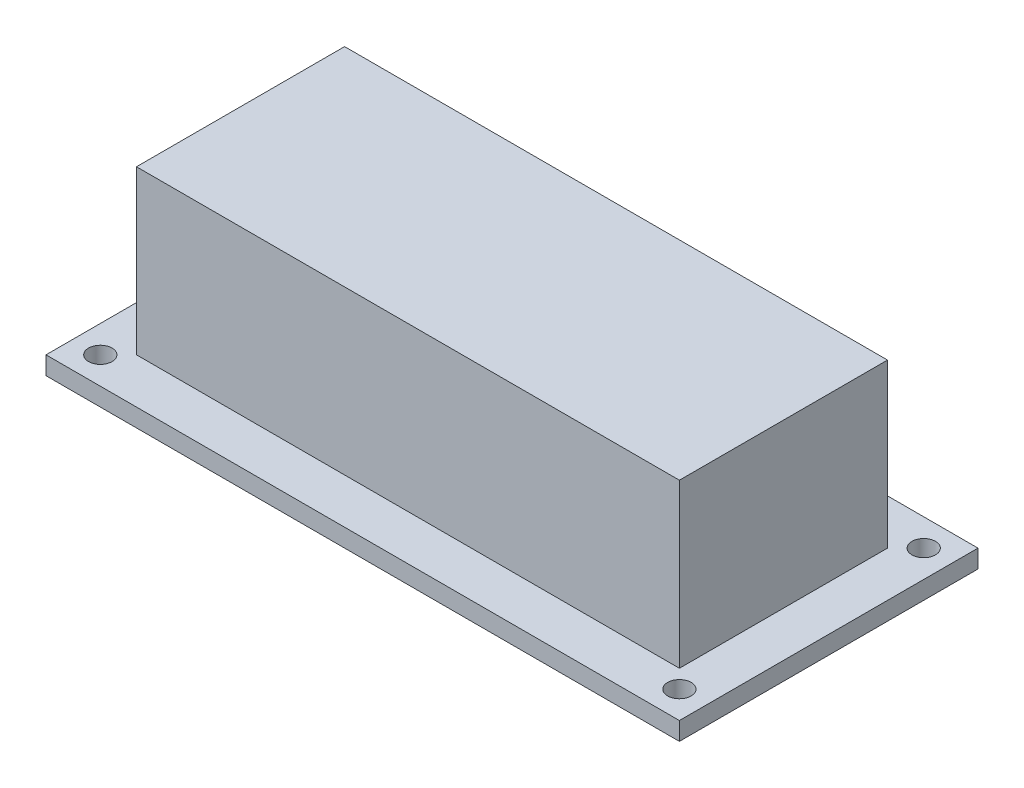
ISO-10303-21;
HEADER;
FILE_DESCRIPTION(('STEP AP214'),'2;1');
FILE_NAME('part.step','',(''),(''),'','','');
FILE_SCHEMA(('AUTOMOTIVE_DESIGN { 1 0 10303 214 1 1 1 1 }'));
ENDSEC;
DATA;
#1=APPLICATION_CONTEXT('core data for automotive mechanical design processes');
#2=APPLICATION_PROTOCOL_DEFINITION('international standard','automotive_design',2000,#1);
#3=PRODUCT_CONTEXT('',#1,'mechanical');
#4=PRODUCT('Part','Part','',(#3));
#5=PRODUCT_RELATED_PRODUCT_CATEGORY('part','',(#4));
#6=PRODUCT_DEFINITION_FORMATION('','',#4);
#7=PRODUCT_DEFINITION_CONTEXT('part definition',#1,'design');
#8=PRODUCT_DEFINITION('design','',#6,#7);
#9=PRODUCT_DEFINITION_SHAPE('','',#8);
#10=(LENGTH_UNIT() NAMED_UNIT(*) SI_UNIT(.MILLI.,.METRE.));
#11=(NAMED_UNIT(*) PLANE_ANGLE_UNIT() SI_UNIT($,.RADIAN.));
#12=(NAMED_UNIT(*) SI_UNIT($,.STERADIAN.) SOLID_ANGLE_UNIT());
#13=UNCERTAINTY_MEASURE_WITH_UNIT(LENGTH_MEASURE(1.E-05),#10,'distance_accuracy_value','');
#14=(GEOMETRIC_REPRESENTATION_CONTEXT(3) GLOBAL_UNCERTAINTY_ASSIGNED_CONTEXT((#13)) GLOBAL_UNIT_ASSIGNED_CONTEXT((#10,
#11,#12)) REPRESENTATION_CONTEXT('',''));
#15=CARTESIAN_POINT('',(0.,0.,0.));
#16=DIRECTION('',(0.,0.,1.));
#17=DIRECTION('',(1.,0.,0.));
#18=AXIS2_PLACEMENT_3D('',#15,#16,#17);
#19=CARTESIAN_POINT('',(0.,2.54,0.));
#20=DIRECTION('',(0.,1.,0.));
#21=DIRECTION('',(0.,0.,1.));
#22=AXIS2_PLACEMENT_3D('',#19,#20,#21);
#23=PLANE('',#22);
#24=CARTESIAN_POINT('',(-40.64,2.54,17.145));
#25=DIRECTION('',(0.,1.,0.));
#26=DIRECTION('',(0.,0.,1.));
#27=AXIS2_PLACEMENT_3D('',#24,#25,#26);
#28=CIRCLE('',#27,1.651);
#29=CARTESIAN_POINT('',(-40.64,2.54,18.796));
#30=VERTEX_POINT('',#29);
#31=EDGE_CURVE('E147',#30,#30,#28,.T.);
#32=ORIENTED_EDGE('',*,*,#31,.F.);
#33=EDGE_LOOP('',(#32));
#34=FACE_BOUND('',#33,.T.);
#35=CARTESIAN_POINT('',(40.64,2.54,17.145));
#36=DIRECTION('',(0.,1.,0.));
#37=DIRECTION('',(0.,0.,1.));
#38=AXIS2_PLACEMENT_3D('',#35,#36,#37);
#39=CIRCLE('',#38,1.651);
#40=CARTESIAN_POINT('',(40.64,2.54,18.796));
#41=VERTEX_POINT('',#40);
#42=EDGE_CURVE('E161',#41,#41,#39,.T.);
#43=ORIENTED_EDGE('',*,*,#42,.F.);
#44=EDGE_LOOP('',(#43));
#45=FACE_BOUND('',#44,.T.);
#46=CARTESIAN_POINT('',(40.64,2.54,-17.145));
#47=DIRECTION('',(0.,1.,0.));
#48=DIRECTION('',(0.,0.,1.));
#49=AXIS2_PLACEMENT_3D('',#46,#47,#48);
#50=CIRCLE('',#49,1.651);
#51=CARTESIAN_POINT('',(40.64,2.54,-15.494));
#52=VERTEX_POINT('',#51);
#53=EDGE_CURVE('E152',#52,#52,#50,.T.);
#54=ORIENTED_EDGE('',*,*,#53,.F.);
#55=EDGE_LOOP('',(#54));
#56=FACE_BOUND('',#55,.T.);
#57=CARTESIAN_POINT('',(-40.64,2.54,-17.145));
#58=DIRECTION('',(0.,1.,0.));
#59=DIRECTION('',(0.,0.,1.));
#60=AXIS2_PLACEMENT_3D('',#57,#58,#59);
#61=CIRCLE('',#60,1.651);
#62=CARTESIAN_POINT('',(-40.64,2.54,-15.494));
#63=VERTEX_POINT('',#62);
#64=EDGE_CURVE('E172',#63,#63,#61,.T.);
#65=ORIENTED_EDGE('',*,*,#64,.F.);
#66=EDGE_LOOP('',(#65));
#67=FACE_BOUND('',#66,.T.);
#68=DIRECTION('',(0.,0.,-1.));
#69=VECTOR('',#68,1.);
#70=CARTESIAN_POINT('',(44.45,2.54,-20.955));
#71=LINE('',#70,#69);
#72=CARTESIAN_POINT('',(44.45,2.54,20.955));
#73=VERTEX_POINT('',#72);
#74=CARTESIAN_POINT('',(44.45,2.54,-20.955));
#75=VERTEX_POINT('',#74);
#76=EDGE_CURVE('E180',#73,#75,#71,.T.);
#77=ORIENTED_EDGE('',*,*,#76,.T.);
#78=DIRECTION('',(-1.,0.,0.));
#79=VECTOR('',#78,1.);
#80=CARTESIAN_POINT('',(-44.45,2.54,-20.955));
#81=LINE('',#80,#79);
#82=CARTESIAN_POINT('',(-44.45,2.54,-20.955));
#83=VERTEX_POINT('',#82);
#84=EDGE_CURVE('E92',#75,#83,#81,.T.);
#85=ORIENTED_EDGE('',*,*,#84,.T.);
#86=DIRECTION('',(0.,0.,1.));
#87=VECTOR('',#86,1.);
#88=CARTESIAN_POINT('',(-44.45,2.54,-20.955));
#89=LINE('',#88,#87);
#90=CARTESIAN_POINT('',(-44.45,2.54,20.955));
#91=VERTEX_POINT('',#90);
#92=EDGE_CURVE('E185',#83,#91,#89,.T.);
#93=ORIENTED_EDGE('',*,*,#92,.T.);
#94=DIRECTION('',(1.,0.,0.));
#95=VECTOR('',#94,1.);
#96=CARTESIAN_POINT('',(-44.45,2.54,20.955));
#97=LINE('',#96,#95);
#98=EDGE_CURVE('E64',#91,#73,#97,.T.);
#99=ORIENTED_EDGE('',*,*,#98,.T.);
#100=EDGE_LOOP('',(#77,#85,#93,#99));
#101=FACE_BOUND('',#100,.T.);
#102=DIRECTION('',(0.,0.,-1.));
#103=VECTOR('',#102,1.);
#104=CARTESIAN_POINT('',(38.1,2.54,14.605));
#105=LINE('',#104,#103);
#106=CARTESIAN_POINT('',(38.1,2.54,14.605));
#107=VERTEX_POINT('',#106);
#108=CARTESIAN_POINT('',(38.1,2.54,-14.605));
#109=VERTEX_POINT('',#108);
#110=EDGE_CURVE('E363',#107,#109,#105,.T.);
#111=ORIENTED_EDGE('',*,*,#110,.F.);
#112=DIRECTION('',(1.,0.,0.));
#113=VECTOR('',#112,1.);
#114=CARTESIAN_POINT('',(-38.1,2.54,14.605));
#115=LINE('',#114,#113);
#116=CARTESIAN_POINT('',(-38.1,2.54,14.605));
#117=VERTEX_POINT('',#116);
#118=EDGE_CURVE('E139',#117,#107,#115,.T.);
#119=ORIENTED_EDGE('',*,*,#118,.F.);
#120=DIRECTION('',(0.,0.,1.));
#121=VECTOR('',#120,1.);
#122=CARTESIAN_POINT('',(-38.1,2.54,-14.605));
#123=LINE('',#122,#121);
#124=CARTESIAN_POINT('',(-38.1,2.54,-14.605));
#125=VERTEX_POINT('',#124);
#126=EDGE_CURVE('E135',#125,#117,#123,.T.);
#127=ORIENTED_EDGE('',*,*,#126,.F.);
#128=DIRECTION('',(-1.,0.,0.));
#129=VECTOR('',#128,1.);
#130=CARTESIAN_POINT('',(38.1,2.54,-14.605));
#131=LINE('',#130,#129);
#132=EDGE_CURVE('E359',#109,#125,#131,.T.);
#133=ORIENTED_EDGE('',*,*,#132,.F.);
#134=EDGE_LOOP('',(#111,#119,#127,#133));
#135=FACE_BOUND('',#134,.T.);
#136=ADVANCED_FACE('F39',(#34,#45,#56,#67,#101,#135),#23,.T.);
#137=CARTESIAN_POINT('',(44.45,2.54,-20.955));
#138=DIRECTION('',(-1.,0.,0.));
#139=DIRECTION('',(0.,0.,1.));
#140=AXIS2_PLACEMENT_3D('',#137,#138,#139);
#141=PLANE('',#140);
#142=DIRECTION('',(0.,0.,-1.));
#143=VECTOR('',#142,1.);
#144=CARTESIAN_POINT('',(44.45,0.,-20.955));
#145=LINE('',#144,#143);
#146=CARTESIAN_POINT('',(44.45,0.,20.955));
#147=VERTEX_POINT('',#146);
#148=CARTESIAN_POINT('',(44.45,0.,-20.955));
#149=VERTEX_POINT('',#148);
#150=EDGE_CURVE('E176',#147,#149,#145,.T.);
#151=ORIENTED_EDGE('',*,*,#150,.T.);
#152=DIRECTION('',(0.,-1.,0.));
#153=VECTOR('',#152,1.);
#154=CARTESIAN_POINT('',(44.45,2.54,-20.955));
#155=LINE('',#154,#153);
#156=EDGE_CURVE('E11',#75,#149,#155,.T.);
#157=ORIENTED_EDGE('',*,*,#156,.F.);
#158=ORIENTED_EDGE('',*,*,#76,.F.);
#159=DIRECTION('',(0.,-1.,0.));
#160=VECTOR('',#159,1.);
#161=CARTESIAN_POINT('',(44.45,2.54,20.955));
#162=LINE('',#161,#160);
#163=EDGE_CURVE('E190',#73,#147,#162,.T.);
#164=ORIENTED_EDGE('',*,*,#163,.T.);
#165=EDGE_LOOP('',(#151,#157,#158,#164));
#166=FACE_BOUND('',#165,.T.);
#167=ADVANCED_FACE('F41',(#166),#141,.F.);
#168=CARTESIAN_POINT('',(-44.45,2.54,-20.955));
#169=DIRECTION('',(0.,0.,1.));
#170=DIRECTION('',(1.,0.,0.));
#171=AXIS2_PLACEMENT_3D('',#168,#169,#170);
#172=PLANE('',#171);
#173=DIRECTION('',(-1.,0.,0.));
#174=VECTOR('',#173,1.);
#175=CARTESIAN_POINT('',(-44.45,0.,-20.955));
#176=LINE('',#175,#174);
#177=CARTESIAN_POINT('',(-44.45,0.,-20.955));
#178=VERTEX_POINT('',#177);
#179=EDGE_CURVE('E194',#149,#178,#176,.T.);
#180=ORIENTED_EDGE('',*,*,#179,.T.);
#181=DIRECTION('',(0.,-1.,0.));
#182=VECTOR('',#181,1.);
#183=CARTESIAN_POINT('',(-44.45,2.54,-20.955));
#184=LINE('',#183,#182);
#185=EDGE_CURVE('E48',#83,#178,#184,.T.);
#186=ORIENTED_EDGE('',*,*,#185,.F.);
#187=ORIENTED_EDGE('',*,*,#84,.F.);
#188=ORIENTED_EDGE('',*,*,#156,.T.);
#189=EDGE_LOOP('',(#180,#186,#187,#188));
#190=FACE_BOUND('',#189,.T.);
#191=ADVANCED_FACE('F229',(#190),#172,.F.);
#192=CARTESIAN_POINT('',(-44.45,2.54,-20.955));
#193=DIRECTION('',(1.,0.,0.));
#194=DIRECTION('',(0.,0.,-1.));
#195=AXIS2_PLACEMENT_3D('',#192,#193,#194);
#196=PLANE('',#195);
#197=DIRECTION('',(0.,0.,1.));
#198=VECTOR('',#197,1.);
#199=CARTESIAN_POINT('',(-44.45,0.,-20.955));
#200=LINE('',#199,#198);
#201=CARTESIAN_POINT('',(-44.45,0.,20.955));
#202=VERTEX_POINT('',#201);
#203=EDGE_CURVE('E197',#178,#202,#200,.T.);
#204=ORIENTED_EDGE('',*,*,#203,.T.);
#205=DIRECTION('',(0.,-1.,0.));
#206=VECTOR('',#205,1.);
#207=CARTESIAN_POINT('',(-44.45,2.54,20.955));
#208=LINE('',#207,#206);
#209=EDGE_CURVE('E204',#91,#202,#208,.T.);
#210=ORIENTED_EDGE('',*,*,#209,.F.);
#211=ORIENTED_EDGE('',*,*,#92,.F.);
#212=ORIENTED_EDGE('',*,*,#185,.T.);
#213=EDGE_LOOP('',(#204,#210,#211,#212));
#214=FACE_BOUND('',#213,.T.);
#215=ADVANCED_FACE('F211',(#214),#196,.F.);
#216=CARTESIAN_POINT('',(-44.45,2.54,20.955));
#217=DIRECTION('',(0.,0.,-1.));
#218=DIRECTION('',(-1.,0.,0.));
#219=AXIS2_PLACEMENT_3D('',#216,#217,#218);
#220=PLANE('',#219);
#221=DIRECTION('',(1.,0.,0.));
#222=VECTOR('',#221,1.);
#223=CARTESIAN_POINT('',(-44.45,0.,20.955));
#224=LINE('',#223,#222);
#225=EDGE_CURVE('E85',#202,#147,#224,.T.);
#226=ORIENTED_EDGE('',*,*,#225,.T.);
#227=ORIENTED_EDGE('',*,*,#163,.F.);
#228=ORIENTED_EDGE('',*,*,#98,.F.);
#229=ORIENTED_EDGE('',*,*,#209,.T.);
#230=EDGE_LOOP('',(#226,#227,#228,#229));
#231=FACE_BOUND('',#230,.T.);
#232=ADVANCED_FACE('F219',(#231),#220,.F.);
#233=CARTESIAN_POINT('',(0.,0.,0.));
#234=DIRECTION('',(0.,1.,0.));
#235=DIRECTION('',(0.,0.,1.));
#236=AXIS2_PLACEMENT_3D('',#233,#234,#235);
#237=PLANE('',#236);
#238=CARTESIAN_POINT('',(-40.64,0.,17.145));
#239=DIRECTION('',(0.,1.,0.));
#240=DIRECTION('',(0.,0.,1.));
#241=AXIS2_PLACEMENT_3D('',#238,#239,#240);
#242=CIRCLE('',#241,1.651);
#243=CARTESIAN_POINT('',(-40.64,0.,18.796));
#244=VERTEX_POINT('',#243);
#245=EDGE_CURVE('E142',#244,#244,#242,.T.);
#246=ORIENTED_EDGE('',*,*,#245,.T.);
#247=EDGE_LOOP('',(#246));
#248=FACE_BOUND('',#247,.T.);
#249=CARTESIAN_POINT('',(40.64,0.,17.145));
#250=DIRECTION('',(0.,1.,0.));
#251=DIRECTION('',(0.,0.,1.));
#252=AXIS2_PLACEMENT_3D('',#249,#250,#251);
#253=CIRCLE('',#252,1.651);
#254=CARTESIAN_POINT('',(40.64,0.,18.796));
#255=VERTEX_POINT('',#254);
#256=EDGE_CURVE('E165',#255,#255,#253,.T.);
#257=ORIENTED_EDGE('',*,*,#256,.T.);
#258=EDGE_LOOP('',(#257));
#259=FACE_BOUND('',#258,.T.);
#260=CARTESIAN_POINT('',(40.64,0.,-17.145));
#261=DIRECTION('',(0.,1.,0.));
#262=DIRECTION('',(0.,0.,1.));
#263=AXIS2_PLACEMENT_3D('',#260,#261,#262);
#264=CIRCLE('',#263,1.651);
#265=CARTESIAN_POINT('',(40.64,0.,-15.494));
#266=VERTEX_POINT('',#265);
#267=EDGE_CURVE('E157',#266,#266,#264,.T.);
#268=ORIENTED_EDGE('',*,*,#267,.T.);
#269=EDGE_LOOP('',(#268));
#270=FACE_BOUND('',#269,.T.);
#271=CARTESIAN_POINT('',(-40.64,0.,-17.145));
#272=DIRECTION('',(0.,1.,0.));
#273=DIRECTION('',(0.,0.,1.));
#274=AXIS2_PLACEMENT_3D('',#271,#272,#273);
#275=CIRCLE('',#274,1.651);
#276=CARTESIAN_POINT('',(-40.64,0.,-15.494));
#277=VERTEX_POINT('',#276);
#278=EDGE_CURVE('E156',#277,#277,#275,.T.);
#279=ORIENTED_EDGE('',*,*,#278,.T.);
#280=EDGE_LOOP('',(#279));
#281=FACE_BOUND('',#280,.T.);
#282=ORIENTED_EDGE('',*,*,#150,.F.);
#283=ORIENTED_EDGE('',*,*,#225,.F.);
#284=ORIENTED_EDGE('',*,*,#203,.F.);
#285=ORIENTED_EDGE('',*,*,#179,.F.);
#286=EDGE_LOOP('',(#282,#283,#284,#285));
#287=FACE_BOUND('',#286,.T.);
#288=ADVANCED_FACE('F215',(#248,#259,#270,#281,#287),#237,.F.);
#289=CARTESIAN_POINT('',(-40.64,2.54,-17.145));
#290=DIRECTION('',(0.,-1.,0.));
#291=DIRECTION('',(0.,0.,-1.));
#292=AXIS2_PLACEMENT_3D('',#289,#290,#291);
#293=CYLINDRICAL_SURFACE('',#292,1.651);
#294=ORIENTED_EDGE('',*,*,#64,.T.);
#295=EDGE_LOOP('',(#294));
#296=FACE_BOUND('',#295,.T.);
#297=ORIENTED_EDGE('',*,*,#278,.F.);
#298=EDGE_LOOP('',(#297));
#299=FACE_BOUND('',#298,.T.);
#300=ADVANCED_FACE('F226',(#296,#299),#293,.F.);
#301=CARTESIAN_POINT('',(40.64,2.54,-17.145));
#302=DIRECTION('',(0.,-1.,0.));
#303=DIRECTION('',(0.,0.,-1.));
#304=AXIS2_PLACEMENT_3D('',#301,#302,#303);
#305=CYLINDRICAL_SURFACE('',#304,1.651);
#306=ORIENTED_EDGE('',*,*,#53,.T.);
#307=EDGE_LOOP('',(#306));
#308=FACE_BOUND('',#307,.T.);
#309=ORIENTED_EDGE('',*,*,#267,.F.);
#310=EDGE_LOOP('',(#309));
#311=FACE_BOUND('',#310,.T.);
#312=ADVANCED_FACE('F242',(#308,#311),#305,.F.);
#313=CARTESIAN_POINT('',(40.64,2.54,17.145));
#314=DIRECTION('',(0.,-1.,0.));
#315=DIRECTION('',(0.,0.,-1.));
#316=AXIS2_PLACEMENT_3D('',#313,#314,#315);
#317=CYLINDRICAL_SURFACE('',#316,1.651);
#318=ORIENTED_EDGE('',*,*,#42,.T.);
#319=EDGE_LOOP('',(#318));
#320=FACE_BOUND('',#319,.T.);
#321=ORIENTED_EDGE('',*,*,#256,.F.);
#322=EDGE_LOOP('',(#321));
#323=FACE_BOUND('',#322,.T.);
#324=ADVANCED_FACE('F247',(#320,#323),#317,.F.);
#325=CARTESIAN_POINT('',(-40.64,2.54,17.145));
#326=DIRECTION('',(0.,-1.,0.));
#327=DIRECTION('',(0.,0.,-1.));
#328=AXIS2_PLACEMENT_3D('',#325,#326,#327);
#329=CYLINDRICAL_SURFACE('',#328,1.651);
#330=ORIENTED_EDGE('',*,*,#31,.T.);
#331=EDGE_LOOP('',(#330));
#332=FACE_BOUND('',#331,.T.);
#333=ORIENTED_EDGE('',*,*,#245,.F.);
#334=EDGE_LOOP('',(#333));
#335=FACE_BOUND('',#334,.T.);
#336=ADVANCED_FACE('F244',(#332,#335),#329,.F.);
#337=CARTESIAN_POINT('',(-38.1,25.4,14.605));
#338=DIRECTION('',(0.,0.,-1.));
#339=DIRECTION('',(-1.,0.,0.));
#340=AXIS2_PLACEMENT_3D('',#337,#338,#339);
#341=PLANE('',#340);
#342=ORIENTED_EDGE('',*,*,#118,.T.);
#343=DIRECTION('',(0.,-1.,0.));
#344=VECTOR('',#343,1.);
#345=CARTESIAN_POINT('',(38.1,25.4,14.605));
#346=LINE('',#345,#344);
#347=CARTESIAN_POINT('',(38.1,25.4,14.605));
#348=VERTEX_POINT('',#347);
#349=EDGE_CURVE('E118',#348,#107,#346,.T.);
#350=ORIENTED_EDGE('',*,*,#349,.F.);
#351=DIRECTION('',(1.,0.,0.));
#352=VECTOR('',#351,1.);
#353=CARTESIAN_POINT('',(-38.1,25.4,14.605));
#354=LINE('',#353,#352);
#355=CARTESIAN_POINT('',(-38.1,25.4,14.605));
#356=VERTEX_POINT('',#355);
#357=EDGE_CURVE('E126',#356,#348,#354,.T.);
#358=ORIENTED_EDGE('',*,*,#357,.F.);
#359=DIRECTION('',(0.,-1.,0.));
#360=VECTOR('',#359,1.);
#361=CARTESIAN_POINT('',(-38.1,25.4,14.605));
#362=LINE('',#361,#360);
#363=EDGE_CURVE('E355',#356,#117,#362,.T.);
#364=ORIENTED_EDGE('',*,*,#363,.T.);
#365=EDGE_LOOP('',(#342,#350,#358,#364));
#366=FACE_BOUND('',#365,.T.);
#367=ADVANCED_FACE('F137',(#366),#341,.F.);
#368=CARTESIAN_POINT('',(38.1,25.4,14.605));
#369=DIRECTION('',(-1.,0.,0.));
#370=DIRECTION('',(0.,0.,1.));
#371=AXIS2_PLACEMENT_3D('',#368,#369,#370);
#372=PLANE('',#371);
#373=ORIENTED_EDGE('',*,*,#110,.T.);
#374=DIRECTION('',(0.,-1.,0.));
#375=VECTOR('',#374,1.);
#376=CARTESIAN_POINT('',(38.1,25.4,-14.605));
#377=LINE('',#376,#375);
#378=CARTESIAN_POINT('',(38.1,25.4,-14.605));
#379=VERTEX_POINT('',#378);
#380=EDGE_CURVE('E121',#379,#109,#377,.T.);
#381=ORIENTED_EDGE('',*,*,#380,.F.);
#382=DIRECTION('',(0.,0.,-1.));
#383=VECTOR('',#382,1.);
#384=CARTESIAN_POINT('',(38.1,25.4,14.605));
#385=LINE('',#384,#383);
#386=EDGE_CURVE('E114',#348,#379,#385,.T.);
#387=ORIENTED_EDGE('',*,*,#386,.F.);
#388=ORIENTED_EDGE('',*,*,#349,.T.);
#389=EDGE_LOOP('',(#373,#381,#387,#388));
#390=FACE_BOUND('',#389,.T.);
#391=ADVANCED_FACE('F116',(#390),#372,.F.);
#392=CARTESIAN_POINT('',(38.1,25.4,-14.605));
#393=DIRECTION('',(0.,0.,1.));
#394=DIRECTION('',(1.,0.,0.));
#395=AXIS2_PLACEMENT_3D('',#392,#393,#394);
#396=PLANE('',#395);
#397=ORIENTED_EDGE('',*,*,#132,.T.);
#398=DIRECTION('',(0.,-1.,0.));
#399=VECTOR('',#398,1.);
#400=CARTESIAN_POINT('',(-38.1,25.4,-14.605));
#401=LINE('',#400,#399);
#402=CARTESIAN_POINT('',(-38.1,25.4,-14.605));
#403=VERTEX_POINT('',#402);
#404=EDGE_CURVE('E55',#403,#125,#401,.T.);
#405=ORIENTED_EDGE('',*,*,#404,.F.);
#406=DIRECTION('',(-1.,0.,0.));
#407=VECTOR('',#406,1.);
#408=CARTESIAN_POINT('',(38.1,25.4,-14.605));
#409=LINE('',#408,#407);
#410=EDGE_CURVE('E125',#379,#403,#409,.T.);
#411=ORIENTED_EDGE('',*,*,#410,.F.);
#412=ORIENTED_EDGE('',*,*,#380,.T.);
#413=EDGE_LOOP('',(#397,#405,#411,#412));
#414=FACE_BOUND('',#413,.T.);
#415=ADVANCED_FACE('F259',(#414),#396,.F.);
#416=CARTESIAN_POINT('',(-38.1,25.4,-14.605));
#417=DIRECTION('',(1.,0.,0.));
#418=DIRECTION('',(0.,0.,-1.));
#419=AXIS2_PLACEMENT_3D('',#416,#417,#418);
#420=PLANE('',#419);
#421=ORIENTED_EDGE('',*,*,#126,.T.);
#422=ORIENTED_EDGE('',*,*,#363,.F.);
#423=DIRECTION('',(0.,0.,1.));
#424=VECTOR('',#423,1.);
#425=CARTESIAN_POINT('',(-38.1,25.4,-14.605));
#426=LINE('',#425,#424);
#427=EDGE_CURVE('E130',#403,#356,#426,.T.);
#428=ORIENTED_EDGE('',*,*,#427,.F.);
#429=ORIENTED_EDGE('',*,*,#404,.T.);
#430=EDGE_LOOP('',(#421,#422,#428,#429));
#431=FACE_BOUND('',#430,.T.);
#432=ADVANCED_FACE('F262',(#431),#420,.F.);
#433=CARTESIAN_POINT('',(0.,25.4,0.));
#434=DIRECTION('',(0.,1.,0.));
#435=DIRECTION('',(0.,0.,1.));
#436=AXIS2_PLACEMENT_3D('',#433,#434,#435);
#437=PLANE('',#436);
#438=ORIENTED_EDGE('',*,*,#357,.T.);
#439=ORIENTED_EDGE('',*,*,#386,.T.);
#440=ORIENTED_EDGE('',*,*,#410,.T.);
#441=ORIENTED_EDGE('',*,*,#427,.T.);
#442=EDGE_LOOP('',(#438,#439,#440,#441));
#443=FACE_BOUND('',#442,.T.);
#444=ADVANCED_FACE('F129',(#443),#437,.T.);
#445=CLOSED_SHELL('',(#136,#167,#191,#215,#232,#288,#300,#312,#324,#336,#367,#391,#415,#432,#444));
#446=MANIFOLD_SOLID_BREP('B2',#445);
#447=ADVANCED_BREP_SHAPE_REPRESENTATION('',(#18,#446),#14);
#448=SHAPE_DEFINITION_REPRESENTATION(#9,#447);
ENDSEC;
END-ISO-10303-21;
